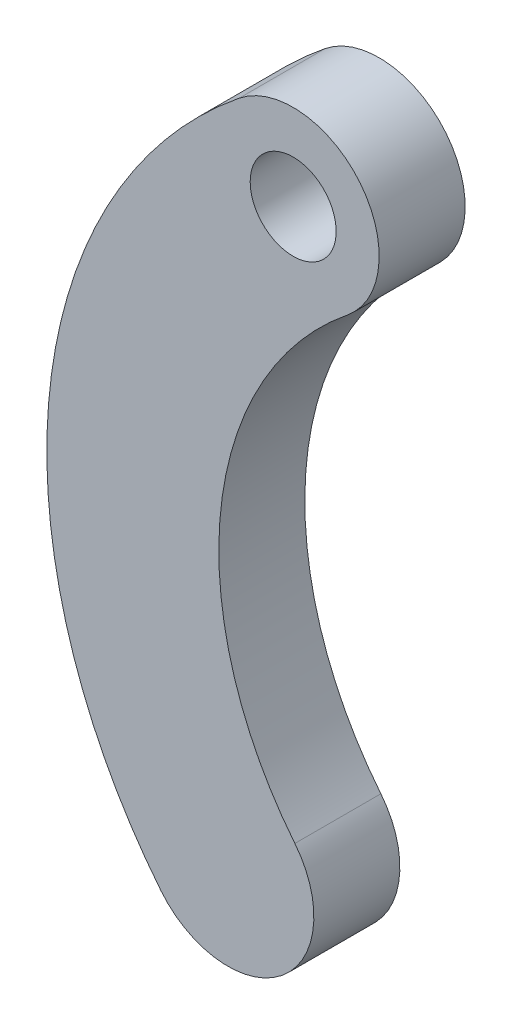
ISO-10303-21;
HEADER;
FILE_DESCRIPTION(('STEP AP214'),'2;1');
FILE_NAME('part.step','',(''),(''),'','','');
FILE_SCHEMA(('AUTOMOTIVE_DESIGN { 1 0 10303 214 1 1 1 1 }'));
ENDSEC;
DATA;
#1=APPLICATION_CONTEXT('core data for automotive mechanical design processes');
#2=APPLICATION_PROTOCOL_DEFINITION('international standard','automotive_design',2000,#1);
#3=PRODUCT_CONTEXT('',#1,'mechanical');
#4=PRODUCT('Part','Part','',(#3));
#5=PRODUCT_RELATED_PRODUCT_CATEGORY('part','',(#4));
#6=PRODUCT_DEFINITION_FORMATION('','',#4);
#7=PRODUCT_DEFINITION_CONTEXT('part definition',#1,'design');
#8=PRODUCT_DEFINITION('design','',#6,#7);
#9=PRODUCT_DEFINITION_SHAPE('','',#8);
#10=(LENGTH_UNIT() NAMED_UNIT(*) SI_UNIT(.MILLI.,.METRE.));
#11=(NAMED_UNIT(*) PLANE_ANGLE_UNIT() SI_UNIT($,.RADIAN.));
#12=(NAMED_UNIT(*) SI_UNIT($,.STERADIAN.) SOLID_ANGLE_UNIT());
#13=UNCERTAINTY_MEASURE_WITH_UNIT(LENGTH_MEASURE(1.E-05),#10,'distance_accuracy_value','');
#14=(GEOMETRIC_REPRESENTATION_CONTEXT(3) GLOBAL_UNCERTAINTY_ASSIGNED_CONTEXT((#13)) GLOBAL_UNIT_ASSIGNED_CONTEXT((#10,
#11,#12)) REPRESENTATION_CONTEXT('',''));
#15=CARTESIAN_POINT('',(0.,0.,0.));
#16=DIRECTION('',(0.,0.,1.));
#17=DIRECTION('',(1.,0.,0.));
#18=AXIS2_PLACEMENT_3D('',#15,#16,#17);
#19=CARTESIAN_POINT('',(2.37615621415008,-1.42492021233816,2.));
#20=DIRECTION('',(0.,0.,1.));
#21=DIRECTION('',(-1.,0.,0.));
#22=AXIS2_PLACEMENT_3D('',#19,#20,#21);
#23=PLANE('',#22);
#24=CARTESIAN_POINT('',(-1.51858062795517,-4.56036674046586,2.));
#25=DIRECTION('',(0.,0.,-1.));
#26=DIRECTION('',(-1.,0.,0.));
#27=AXIS2_PLACEMENT_3D('',#24,#25,#26);
#28=CIRCLE('',#27,2.);
#29=CARTESIAN_POINT('',(0.0393141088869346,-3.30618812921478,2.));
#30=VERTEX_POINT('',#29);
#31=CARTESIAN_POINT('',(-3.07647536479727,-5.81454535171694,2.));
#32=VERTEX_POINT('',#31);
#33=EDGE_CURVE('E91',#30,#32,#28,.T.);
#34=ORIENTED_EDGE('',*,*,#33,.F.);
#35=CARTESIAN_POINT('',(6.27089305625533,1.71052631578953,2.));
#36=DIRECTION('',(0.,0.,1.));
#37=DIRECTION('',(-1.,0.,0.));
#38=AXIS2_PLACEMENT_3D('',#35,#36,#37);
#39=CIRCLE('',#38,8.);
#40=CARTESIAN_POINT('',(1.25417861125101,7.94210526315793,2.));
#41=VERTEX_POINT('',#40);
#42=EDGE_CURVE('E94',#41,#30,#39,.T.);
#43=ORIENTED_EDGE('',*,*,#42,.F.);
#44=CARTESIAN_POINT('',(0.,9.50000000000003,2.));
#45=DIRECTION('',(0.,0.,-1.));
#46=DIRECTION('',(-1.,0.,0.));
#47=AXIS2_PLACEMENT_3D('',#44,#45,#46);
#48=CIRCLE('',#47,2.);
#49=CARTESIAN_POINT('',(-1.25417861125115,11.0578947368421,2.));
#50=VERTEX_POINT('',#49);
#51=EDGE_CURVE('E82',#50,#41,#48,.T.);
#52=ORIENTED_EDGE('',*,*,#51,.F.);
#53=CARTESIAN_POINT('',(6.27089305625533,1.71052631578953,2.));
#54=DIRECTION('',(0.,0.,-1.));
#55=DIRECTION('',(-1.,0.,0.));
#56=AXIS2_PLACEMENT_3D('',#53,#54,#55);
#57=CIRCLE('',#56,12.);
#58=EDGE_CURVE('E87',#32,#50,#57,.T.);
#59=ORIENTED_EDGE('',*,*,#58,.F.);
#60=EDGE_LOOP('',(#34,#43,#52,#59));
#61=FACE_BOUND('',#60,.T.);
#62=CARTESIAN_POINT('',(0.,9.50000000000003,2.));
#63=DIRECTION('',(0.,0.,-1.));
#64=DIRECTION('',(-1.,0.,0.));
#65=AXIS2_PLACEMENT_3D('',#62,#63,#64);
#66=CIRCLE('',#65,1.);
#67=CARTESIAN_POINT('',(-1.00000000000007,9.50000000000003,2.));
#68=VERTEX_POINT('',#67);
#69=EDGE_CURVE('E103',#68,#68,#66,.T.);
#70=ORIENTED_EDGE('',*,*,#69,.T.);
#71=EDGE_LOOP('',(#70));
#72=FACE_BOUND('',#71,.T.);
#73=ADVANCED_FACE('F35',(#61,#72),#23,.T.);
#74=CARTESIAN_POINT('',(2.37615621415008,-1.42492021233816,0.));
#75=DIRECTION('',(0.,0.,1.));
#76=DIRECTION('',(-1.,0.,0.));
#77=AXIS2_PLACEMENT_3D('',#74,#75,#76);
#78=PLANE('',#77);
#79=CARTESIAN_POINT('',(-1.51858062795517,-4.56036674046586,0.));
#80=DIRECTION('',(0.,0.,-1.));
#81=DIRECTION('',(-1.,0.,0.));
#82=AXIS2_PLACEMENT_3D('',#79,#80,#81);
#83=CIRCLE('',#82,2.);
#84=CARTESIAN_POINT('',(0.0393141088869346,-3.30618812921478,0.));
#85=VERTEX_POINT('',#84);
#86=CARTESIAN_POINT('',(-3.07647536479727,-5.81454535171694,0.));
#87=VERTEX_POINT('',#86);
#88=EDGE_CURVE('E99',#85,#87,#83,.T.);
#89=ORIENTED_EDGE('',*,*,#88,.T.);
#90=CARTESIAN_POINT('',(6.27089305625533,1.71052631578953,0.));
#91=DIRECTION('',(0.,0.,-1.));
#92=DIRECTION('',(-1.,0.,0.));
#93=AXIS2_PLACEMENT_3D('',#90,#91,#92);
#94=CIRCLE('',#93,12.);
#95=CARTESIAN_POINT('',(-1.25417861125115,11.0578947368421,0.));
#96=VERTEX_POINT('',#95);
#97=EDGE_CURVE('E102',#87,#96,#94,.T.);
#98=ORIENTED_EDGE('',*,*,#97,.T.);
#99=CARTESIAN_POINT('',(0.,9.50000000000003,0.));
#100=DIRECTION('',(0.,0.,-1.));
#101=DIRECTION('',(-1.,0.,0.));
#102=AXIS2_PLACEMENT_3D('',#99,#100,#101);
#103=CIRCLE('',#102,2.);
#104=CARTESIAN_POINT('',(1.25417861125101,7.94210526315793,0.));
#105=VERTEX_POINT('',#104);
#106=EDGE_CURVE('E85',#96,#105,#103,.T.);
#107=ORIENTED_EDGE('',*,*,#106,.T.);
#108=CARTESIAN_POINT('',(6.27089305625533,1.71052631578953,0.));
#109=DIRECTION('',(0.,0.,1.));
#110=DIRECTION('',(-1.,0.,0.));
#111=AXIS2_PLACEMENT_3D('',#108,#109,#110);
#112=CIRCLE('',#111,8.);
#113=EDGE_CURVE('E106',#105,#85,#112,.T.);
#114=ORIENTED_EDGE('',*,*,#113,.T.);
#115=EDGE_LOOP('',(#89,#98,#107,#114));
#116=FACE_BOUND('',#115,.T.);
#117=CARTESIAN_POINT('',(0.,9.50000000000003,0.));
#118=DIRECTION('',(0.,0.,-1.));
#119=DIRECTION('',(-1.,0.,0.));
#120=AXIS2_PLACEMENT_3D('',#117,#118,#119);
#121=CIRCLE('',#120,1.);
#122=CARTESIAN_POINT('',(-1.00000000000007,9.50000000000003,0.));
#123=VERTEX_POINT('',#122);
#124=EDGE_CURVE('E111',#123,#123,#121,.T.);
#125=ORIENTED_EDGE('',*,*,#124,.F.);
#126=EDGE_LOOP('',(#125));
#127=FACE_BOUND('',#126,.T.);
#128=ADVANCED_FACE('F124',(#116,#127),#78,.F.);
#129=CARTESIAN_POINT('',(-1.51858062795517,-4.56036674046586,2.));
#130=DIRECTION('',(0.,0.,-1.));
#131=DIRECTION('',(1.,0.,0.));
#132=AXIS2_PLACEMENT_3D('',#129,#130,#131);
#133=CYLINDRICAL_SURFACE('',#132,2.);
#134=ORIENTED_EDGE('',*,*,#88,.F.);
#135=DIRECTION('',(0.,0.,-1.));
#136=VECTOR('',#135,1.);
#137=CARTESIAN_POINT('',(0.0393141088869346,-3.30618812921478,2.));
#138=LINE('',#137,#136);
#139=EDGE_CURVE('E52',#30,#85,#138,.T.);
#140=ORIENTED_EDGE('',*,*,#139,.F.);
#141=ORIENTED_EDGE('',*,*,#33,.T.);
#142=DIRECTION('',(0.,0.,-1.));
#143=VECTOR('',#142,1.);
#144=CARTESIAN_POINT('',(-3.07647536479727,-5.81454535171694,2.));
#145=LINE('',#144,#143);
#146=EDGE_CURVE('E11',#32,#87,#145,.T.);
#147=ORIENTED_EDGE('',*,*,#146,.T.);
#148=EDGE_LOOP('',(#134,#140,#141,#147));
#149=FACE_BOUND('',#148,.T.);
#150=ADVANCED_FACE('F37',(#149),#133,.T.);
#151=CARTESIAN_POINT('',(6.27089305625533,1.71052631578953,2.));
#152=DIRECTION('',(0.,0.,-1.));
#153=DIRECTION('',(1.,0.,0.));
#154=AXIS2_PLACEMENT_3D('',#151,#152,#153);
#155=CYLINDRICAL_SURFACE('',#154,12.);
#156=ORIENTED_EDGE('',*,*,#97,.F.);
#157=ORIENTED_EDGE('',*,*,#146,.F.);
#158=ORIENTED_EDGE('',*,*,#58,.T.);
#159=DIRECTION('',(0.,0.,-1.));
#160=VECTOR('',#159,1.);
#161=CARTESIAN_POINT('',(-1.25417861125115,11.0578947368421,2.));
#162=LINE('',#161,#160);
#163=EDGE_CURVE('E44',#50,#96,#162,.T.);
#164=ORIENTED_EDGE('',*,*,#163,.T.);
#165=EDGE_LOOP('',(#156,#157,#158,#164));
#166=FACE_BOUND('',#165,.T.);
#167=ADVANCED_FACE('F88',(#166),#155,.T.);
#168=CARTESIAN_POINT('',(0.,9.50000000000003,2.));
#169=DIRECTION('',(0.,0.,-1.));
#170=DIRECTION('',(1.,0.,0.));
#171=AXIS2_PLACEMENT_3D('',#168,#169,#170);
#172=CYLINDRICAL_SURFACE('',#171,2.);
#173=ORIENTED_EDGE('',*,*,#106,.F.);
#174=ORIENTED_EDGE('',*,*,#163,.F.);
#175=ORIENTED_EDGE('',*,*,#51,.T.);
#176=DIRECTION('',(0.,0.,-1.));
#177=VECTOR('',#176,1.);
#178=CARTESIAN_POINT('',(1.25417861125101,7.94210526315793,2.));
#179=LINE('',#178,#177);
#180=EDGE_CURVE('E68',#41,#105,#179,.T.);
#181=ORIENTED_EDGE('',*,*,#180,.T.);
#182=EDGE_LOOP('',(#173,#174,#175,#181));
#183=FACE_BOUND('',#182,.T.);
#184=ADVANCED_FACE('F80',(#183),#172,.T.);
#185=CARTESIAN_POINT('',(6.27089305625533,1.71052631578953,2.));
#186=DIRECTION('',(0.,0.,-1.));
#187=DIRECTION('',(1.,0.,0.));
#188=AXIS2_PLACEMENT_3D('',#185,#186,#187);
#189=CYLINDRICAL_SURFACE('',#188,8.);
#190=ORIENTED_EDGE('',*,*,#113,.F.);
#191=ORIENTED_EDGE('',*,*,#180,.F.);
#192=ORIENTED_EDGE('',*,*,#42,.T.);
#193=ORIENTED_EDGE('',*,*,#139,.T.);
#194=EDGE_LOOP('',(#190,#191,#192,#193));
#195=FACE_BOUND('',#194,.T.);
#196=ADVANCED_FACE('F120',(#195),#189,.F.);
#197=CARTESIAN_POINT('',(0.,9.50000000000003,2.));
#198=DIRECTION('',(0.,0.,-1.));
#199=DIRECTION('',(1.,0.,0.));
#200=AXIS2_PLACEMENT_3D('',#197,#198,#199);
#201=CYLINDRICAL_SURFACE('',#200,1.);
#202=ORIENTED_EDGE('',*,*,#69,.F.);
#203=EDGE_LOOP('',(#202));
#204=FACE_BOUND('',#203,.T.);
#205=ORIENTED_EDGE('',*,*,#124,.T.);
#206=EDGE_LOOP('',(#205));
#207=FACE_BOUND('',#206,.T.);
#208=ADVANCED_FACE('F117',(#204,#207),#201,.F.);
#209=CLOSED_SHELL('',(#73,#128,#150,#167,#184,#196,#208));
#210=MANIFOLD_SOLID_BREP('B2',#209);
#211=ADVANCED_BREP_SHAPE_REPRESENTATION('',(#18,#210),#14);
#212=SHAPE_DEFINITION_REPRESENTATION(#9,#211);
ENDSEC;
END-ISO-10303-21;
